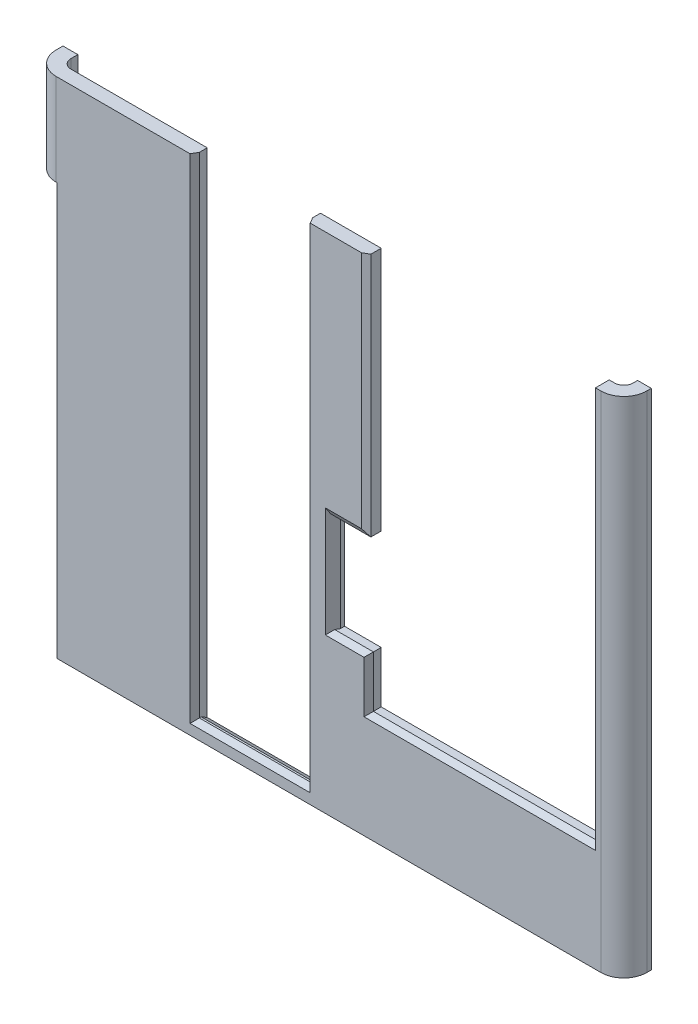
ISO-10303-21;
HEADER;
FILE_DESCRIPTION(('STEP AP214'),'2;1');
FILE_NAME('part.step','',(''),(''),'','','');
FILE_SCHEMA(('AUTOMOTIVE_DESIGN { 1 0 10303 214 1 1 1 1 }'));
ENDSEC;
DATA;
#1=APPLICATION_CONTEXT('core data for automotive mechanical design processes');
#2=APPLICATION_PROTOCOL_DEFINITION('international standard','automotive_design',2000,#1);
#3=PRODUCT_CONTEXT('',#1,'mechanical');
#4=PRODUCT('Part','Part','',(#3));
#5=PRODUCT_RELATED_PRODUCT_CATEGORY('part','',(#4));
#6=PRODUCT_DEFINITION_FORMATION('','',#4);
#7=PRODUCT_DEFINITION_CONTEXT('part definition',#1,'design');
#8=PRODUCT_DEFINITION('design','',#6,#7);
#9=PRODUCT_DEFINITION_SHAPE('','',#8);
#10=(LENGTH_UNIT() NAMED_UNIT(*) SI_UNIT(.MILLI.,.METRE.));
#11=(NAMED_UNIT(*) PLANE_ANGLE_UNIT() SI_UNIT($,.RADIAN.));
#12=(NAMED_UNIT(*) SI_UNIT($,.STERADIAN.) SOLID_ANGLE_UNIT());
#13=UNCERTAINTY_MEASURE_WITH_UNIT(LENGTH_MEASURE(1.E-05),#10,'distance_accuracy_value','');
#14=(GEOMETRIC_REPRESENTATION_CONTEXT(3) GLOBAL_UNCERTAINTY_ASSIGNED_CONTEXT((#13)) GLOBAL_UNIT_ASSIGNED_CONTEXT((#10,
#11,#12)) REPRESENTATION_CONTEXT('',''));
#15=CARTESIAN_POINT('',(0.,0.,0.));
#16=DIRECTION('',(0.,0.,1.));
#17=DIRECTION('',(1.,0.,0.));
#18=AXIS2_PLACEMENT_3D('',#15,#16,#17);
#19=CARTESIAN_POINT('',(0.,0.,0.));
#20=DIRECTION('',(0.,0.,1.));
#21=DIRECTION('',(1.,0.,0.));
#22=AXIS2_PLACEMENT_3D('',#19,#20,#21);
#23=PLANE('',#22);
#24=DIRECTION('',(1.,0.,0.));
#25=VECTOR('',#24,1.);
#26=CARTESIAN_POINT('',(-60.5,-55.,0.));
#27=LINE('',#26,#25);
#28=CARTESIAN_POINT('',(-63.25,-55.,0.));
#29=VERTEX_POINT('',#28);
#30=CARTESIAN_POINT('',(55.5,-55.,0.));
#31=VERTEX_POINT('',#30);
#32=EDGE_CURVE('E372',#29,#31,#27,.T.);
#33=ORIENTED_EDGE('',*,*,#32,.F.);
#34=DIRECTION('',(0.,-1.,0.));
#35=VECTOR('',#34,1.);
#36=CARTESIAN_POINT('',(-63.25,55.,0.));
#37=LINE('',#36,#35);
#38=CARTESIAN_POINT('',(-63.25,35.,0.));
#39=VERTEX_POINT('',#38);
#40=EDGE_CURVE('E499',#29,#39,#37,.F.);
#41=ORIENTED_EDGE('',*,*,#40,.T.);
#42=CARTESIAN_POINT('',(-63.25,55.,0.));
#43=VERTEX_POINT('',#42);
#44=EDGE_CURVE('E498',#39,#43,#37,.F.);
#45=ORIENTED_EDGE('',*,*,#44,.T.);
#46=DIRECTION('',(-1.,0.,0.));
#47=VECTOR('',#46,1.);
#48=CARTESIAN_POINT('',(-60.5,55.,0.));
#49=LINE('',#48,#47);
#50=CARTESIAN_POINT('',(-33.5,55.,0.));
#51=VERTEX_POINT('',#50);
#52=EDGE_CURVE('E383',#51,#43,#49,.T.);
#53=ORIENTED_EDGE('',*,*,#52,.F.);
#54=DIRECTION('',(0.,1.,0.));
#55=VECTOR('',#54,1.);
#56=CARTESIAN_POINT('',(-33.5,55.,0.));
#57=LINE('',#56,#55);
#58=CARTESIAN_POINT('',(-33.5,-52.75,0.));
#59=VERTEX_POINT('',#58);
#60=EDGE_CURVE('E322',#59,#51,#57,.T.);
#61=ORIENTED_EDGE('',*,*,#60,.F.);
#62=DIRECTION('',(1.,0.,0.));
#63=VECTOR('',#62,1.);
#64=CARTESIAN_POINT('',(0.,-52.75,0.));
#65=LINE('',#64,#63);
#66=CARTESIAN_POINT('',(-8.74999999999999,-52.75,0.));
#67=VERTEX_POINT('',#66);
#68=EDGE_CURVE('E437',#59,#67,#65,.T.);
#69=ORIENTED_EDGE('',*,*,#68,.T.);
#70=DIRECTION('',(0.,-1.,0.));
#71=VECTOR('',#70,1.);
#72=CARTESIAN_POINT('',(-8.75,55.,0.));
#73=LINE('',#72,#71);
#74=CARTESIAN_POINT('',(-8.75,55.,0.));
#75=VERTEX_POINT('',#74);
#76=EDGE_CURVE('E320',#75,#67,#73,.T.);
#77=ORIENTED_EDGE('',*,*,#76,.F.);
#78=CARTESIAN_POINT('',(4.5,55.,0.));
#79=VERTEX_POINT('',#78);
#80=EDGE_CURVE('E386',#79,#75,#49,.T.);
#81=ORIENTED_EDGE('',*,*,#80,.F.);
#82=DIRECTION('',(0.,1.,0.));
#83=VECTOR('',#82,1.);
#84=CARTESIAN_POINT('',(4.5,55.,0.));
#85=LINE('',#84,#83);
#86=CARTESIAN_POINT('',(4.5,1.5,0.));
#87=VERTEX_POINT('',#86);
#88=EDGE_CURVE('E338',#87,#79,#85,.T.);
#89=ORIENTED_EDGE('',*,*,#88,.F.);
#90=DIRECTION('',(-1.,0.,0.));
#91=VECTOR('',#90,1.);
#92=CARTESIAN_POINT('',(0.,1.5,0.));
#93=LINE('',#92,#91);
#94=CARTESIAN_POINT('',(-3.5,1.5,0.));
#95=VERTEX_POINT('',#94);
#96=EDGE_CURVE('E299',#87,#95,#93,.T.);
#97=ORIENTED_EDGE('',*,*,#96,.T.);
#98=DIRECTION('',(0.,1.,0.));
#99=VECTOR('',#98,1.);
#100=CARTESIAN_POINT('',(-3.5,0.,0.));
#101=LINE('',#100,#99);
#102=CARTESIAN_POINT('',(-3.5,-20.5,0.));
#103=VERTEX_POINT('',#102);
#104=EDGE_CURVE('E302',#103,#95,#101,.T.);
#105=ORIENTED_EDGE('',*,*,#104,.F.);
#106=DIRECTION('',(-1.,0.,0.));
#107=VECTOR('',#106,1.);
#108=CARTESIAN_POINT('',(0.,-20.5,0.));
#109=LINE('',#108,#107);
#110=CARTESIAN_POINT('',(4.50000000000001,-20.5,0.));
#111=VERTEX_POINT('',#110);
#112=EDGE_CURVE('E305',#111,#103,#109,.T.);
#113=ORIENTED_EDGE('',*,*,#112,.F.);
#114=CARTESIAN_POINT('',(4.50000000000001,-31.75,0.));
#115=VERTEX_POINT('',#114);
#116=EDGE_CURVE('E340',#115,#111,#85,.T.);
#117=ORIENTED_EDGE('',*,*,#116,.F.);
#118=DIRECTION('',(-1.,0.,0.));
#119=VECTOR('',#118,1.);
#120=CARTESIAN_POINT('',(4.50000000000001,-31.75,0.));
#121=LINE('',#120,#119);
#122=CARTESIAN_POINT('',(54.3,-31.75,0.));
#123=VERTEX_POINT('',#122);
#124=EDGE_CURVE('E335',#123,#115,#121,.T.);
#125=ORIENTED_EDGE('',*,*,#124,.F.);
#126=DIRECTION('',(0.,-1.,0.));
#127=VECTOR('',#126,1.);
#128=CARTESIAN_POINT('',(54.3,55.,0.));
#129=LINE('',#128,#127);
#130=CARTESIAN_POINT('',(54.3,55.,0.));
#131=VERTEX_POINT('',#130);
#132=EDGE_CURVE('E336',#131,#123,#129,.T.);
#133=ORIENTED_EDGE('',*,*,#132,.F.);
#134=CARTESIAN_POINT('',(55.5,55.,0.));
#135=VERTEX_POINT('',#134);
#136=EDGE_CURVE('E376',#135,#131,#49,.T.);
#137=ORIENTED_EDGE('',*,*,#136,.F.);
#138=DIRECTION('',(0.,1.,0.));
#139=VECTOR('',#138,1.);
#140=CARTESIAN_POINT('',(55.5,-55.,0.));
#141=LINE('',#140,#139);
#142=EDGE_CURVE('E394',#135,#31,#141,.F.);
#143=ORIENTED_EDGE('',*,*,#142,.T.);
#144=EDGE_LOOP('',(#33,#41,#45,#53,#61,#69,#77,#81,#89,#97,#105,#113,#117,#125,#133,#137,#143));
#145=FACE_BOUND('',#144,.T.);
#146=ADVANCED_FACE('F41',(#145),#23,.F.);
#147=CARTESIAN_POINT('',(0.,0.,3.));
#148=DIRECTION('',(0.,0.,1.));
#149=DIRECTION('',(1.,0.,0.));
#150=AXIS2_PLACEMENT_3D('',#147,#148,#149);
#151=PLANE('',#150);
#152=DIRECTION('',(1.,0.,0.));
#153=VECTOR('',#152,1.);
#154=CARTESIAN_POINT('',(-68.5,35.,3.));
#155=LINE('',#154,#153);
#156=CARTESIAN_POINT('',(-63.5,35.,3.));
#157=VERTEX_POINT('',#156);
#158=CARTESIAN_POINT('',(-63.25,35.,3.));
#159=VERTEX_POINT('',#158);
#160=EDGE_CURVE('E55',#157,#159,#155,.T.);
#161=ORIENTED_EDGE('',*,*,#160,.T.);
#162=DIRECTION('',(0.,-1.,0.));
#163=VECTOR('',#162,1.);
#164=CARTESIAN_POINT('',(-63.25,-55.,3.));
#165=LINE('',#164,#163);
#166=CARTESIAN_POINT('',(-63.25,-55.,3.));
#167=VERTEX_POINT('',#166);
#168=EDGE_CURVE('E258',#159,#167,#165,.T.);
#169=ORIENTED_EDGE('',*,*,#168,.T.);
#170=DIRECTION('',(1.,0.,0.));
#171=VECTOR('',#170,1.);
#172=CARTESIAN_POINT('',(-60.5,-55.,3.));
#173=LINE('',#172,#171);
#174=CARTESIAN_POINT('',(55.5,-55.,3.));
#175=VERTEX_POINT('',#174);
#176=EDGE_CURVE('E373',#167,#175,#173,.T.);
#177=ORIENTED_EDGE('',*,*,#176,.T.);
#178=DIRECTION('',(0.,1.,0.));
#179=VECTOR('',#178,1.);
#180=CARTESIAN_POINT('',(55.5,55.,3.));
#181=LINE('',#180,#179);
#182=CARTESIAN_POINT('',(55.5,55.,3.));
#183=VERTEX_POINT('',#182);
#184=EDGE_CURVE('E401',#175,#183,#181,.T.);
#185=ORIENTED_EDGE('',*,*,#184,.T.);
#186=DIRECTION('',(-1.,0.,0.));
#187=VECTOR('',#186,1.);
#188=CARTESIAN_POINT('',(-60.5,55.,3.));
#189=LINE('',#188,#187);
#190=CARTESIAN_POINT('',(54.3,55.,3.));
#191=VERTEX_POINT('',#190);
#192=EDGE_CURVE('E377',#183,#191,#189,.T.);
#193=ORIENTED_EDGE('',*,*,#192,.T.);
#194=DIRECTION('',(0.,1.,0.));
#195=VECTOR('',#194,1.);
#196=CARTESIAN_POINT('',(54.3,55.,3.));
#197=LINE('',#196,#195);
#198=CARTESIAN_POINT('',(54.3,-32.5,3.));
#199=VERTEX_POINT('',#198);
#200=EDGE_CURVE('E343',#199,#191,#197,.T.);
#201=ORIENTED_EDGE('',*,*,#200,.F.);
#202=DIRECTION('',(-1.,0.,0.));
#203=VECTOR('',#202,1.);
#204=CARTESIAN_POINT('',(4.50000000000001,-32.5,3.));
#205=LINE('',#204,#203);
#206=CARTESIAN_POINT('',(3.75,-32.5,3.));
#207=VERTEX_POINT('',#206);
#208=EDGE_CURVE('E452',#199,#207,#205,.T.);
#209=ORIENTED_EDGE('',*,*,#208,.T.);
#210=DIRECTION('',(0.,1.,0.));
#211=VECTOR('',#210,1.);
#212=CARTESIAN_POINT('',(3.74999999999999,-20.5,3.));
#213=LINE('',#212,#211);
#214=CARTESIAN_POINT('',(3.74999999999999,-21.25,3.));
#215=VERTEX_POINT('',#214);
#216=EDGE_CURVE('E450',#207,#215,#213,.T.);
#217=ORIENTED_EDGE('',*,*,#216,.T.);
#218=DIRECTION('',(-1.,0.,0.));
#219=VECTOR('',#218,1.);
#220=CARTESIAN_POINT('',(-3.5,-21.25,3.));
#221=LINE('',#220,#219);
#222=CARTESIAN_POINT('',(-4.69999999999999,-21.25,3.));
#223=VERTEX_POINT('',#222);
#224=EDGE_CURVE('E448',#215,#223,#221,.T.);
#225=ORIENTED_EDGE('',*,*,#224,.T.);
#226=DIRECTION('',(0.,1.,0.));
#227=VECTOR('',#226,1.);
#228=CARTESIAN_POINT('',(-4.69999999999999,2.79903810567664,3.));
#229=LINE('',#228,#227);
#230=CARTESIAN_POINT('',(-4.69999999999999,2.79903810567664,3.));
#231=VERTEX_POINT('',#230);
#232=EDGE_CURVE('E481',#223,#231,#229,.T.);
#233=ORIENTED_EDGE('',*,*,#232,.T.);
#234=DIRECTION('',(1.,0.,0.));
#235=VECTOR('',#234,1.);
#236=CARTESIAN_POINT('',(0.,2.79903810567664,3.));
#237=LINE('',#236,#235);
#238=CARTESIAN_POINT('',(3.20096189432337,2.79903810567664,3.));
#239=VERTEX_POINT('',#238);
#240=EDGE_CURVE('E454',#231,#239,#237,.T.);
#241=ORIENTED_EDGE('',*,*,#240,.T.);
#242=DIRECTION('',(0.,1.,0.));
#243=VECTOR('',#242,1.);
#244=CARTESIAN_POINT('',(3.20096189432336,55.,3.));
#245=LINE('',#244,#243);
#246=CARTESIAN_POINT('',(3.20096189432337,55.,3.));
#247=VERTEX_POINT('',#246);
#248=EDGE_CURVE('E456',#239,#247,#245,.T.);
#249=ORIENTED_EDGE('',*,*,#248,.T.);
#250=CARTESIAN_POINT('',(-7.99999999999999,55.,3.));
#251=VERTEX_POINT('',#250);
#252=EDGE_CURVE('E381',#247,#251,#189,.T.);
#253=ORIENTED_EDGE('',*,*,#252,.T.);
#254=DIRECTION('',(0.,-1.,0.));
#255=VECTOR('',#254,1.);
#256=CARTESIAN_POINT('',(-7.99999999999997,-52.,3.));
#257=LINE('',#256,#255);
#258=CARTESIAN_POINT('',(-7.99999999999997,-52.75,3.));
#259=VERTEX_POINT('',#258);
#260=EDGE_CURVE('E416',#251,#259,#257,.T.);
#261=ORIENTED_EDGE('',*,*,#260,.T.);
#262=DIRECTION('',(-1.,0.,0.));
#263=VECTOR('',#262,1.);
#264=CARTESIAN_POINT('',(-33.5,-52.75,3.));
#265=LINE('',#264,#263);
#266=CARTESIAN_POINT('',(-34.25,-52.75,3.));
#267=VERTEX_POINT('',#266);
#268=EDGE_CURVE('E414',#259,#267,#265,.T.);
#269=ORIENTED_EDGE('',*,*,#268,.T.);
#270=DIRECTION('',(0.,1.,0.));
#271=VECTOR('',#270,1.);
#272=CARTESIAN_POINT('',(-34.25,55.,3.));
#273=LINE('',#272,#271);
#274=CARTESIAN_POINT('',(-34.25,55.,3.));
#275=VERTEX_POINT('',#274);
#276=EDGE_CURVE('E418',#267,#275,#273,.T.);
#277=ORIENTED_EDGE('',*,*,#276,.T.);
#278=CARTESIAN_POINT('',(-63.5,55.,3.));
#279=VERTEX_POINT('',#278);
#280=EDGE_CURVE('E375',#275,#279,#189,.T.);
#281=ORIENTED_EDGE('',*,*,#280,.T.);
#282=DIRECTION('',(0.,1.,0.));
#283=VECTOR('',#282,1.);
#284=CARTESIAN_POINT('',(-63.5,0.,3.));
#285=LINE('',#284,#283);
#286=EDGE_CURVE('E49',#279,#157,#285,.F.);
#287=ORIENTED_EDGE('',*,*,#286,.T.);
#288=EDGE_LOOP('',(#161,#169,#177,#185,#193,#201,#209,#217,#225,#233,#241,#249,#253,#261,#269,
#277,#281,#287));
#289=FACE_BOUND('',#288,.T.);
#290=ADVANCED_FACE('F272',(#289),#151,.T.);
#291=CARTESIAN_POINT('',(4.5,55.,-109.825145117136));
#292=DIRECTION('',(-1.,0.,0.));
#293=DIRECTION('',(0.,-1.,0.));
#294=AXIS2_PLACEMENT_3D('',#291,#292,#293);
#295=PLANE('',#294);
#296=DIRECTION('',(0.,0.,1.));
#297=VECTOR('',#296,1.);
#298=CARTESIAN_POINT('',(4.5,55.,-109.825145117136));
#299=LINE('',#298,#297);
#300=CARTESIAN_POINT('',(4.5,55.,2.25));
#301=VERTEX_POINT('',#300);
#302=EDGE_CURVE('E339',#79,#301,#299,.T.);
#303=ORIENTED_EDGE('',*,*,#302,.T.);
#304=DIRECTION('',(0.,-1.,0.));
#305=VECTOR('',#304,1.);
#306=CARTESIAN_POINT('',(4.5,1.5,2.25));
#307=LINE('',#306,#305);
#308=CARTESIAN_POINT('',(4.5,1.5,2.25));
#309=VERTEX_POINT('',#308);
#310=EDGE_CURVE('E445',#301,#309,#307,.T.);
#311=ORIENTED_EDGE('',*,*,#310,.T.);
#312=DIRECTION('',(0.,0.,1.));
#313=VECTOR('',#312,1.);
#314=CARTESIAN_POINT('',(4.5,1.5,-23.4093998214393));
#315=LINE('',#314,#313);
#316=EDGE_CURVE('E308',#87,#309,#315,.T.);
#317=ORIENTED_EDGE('',*,*,#316,.F.);
#318=ORIENTED_EDGE('',*,*,#88,.T.);
#319=EDGE_LOOP('',(#303,#311,#317,#318));
#320=FACE_BOUND('',#319,.T.);
#321=ADVANCED_FACE('F586',(#320),#295,.F.);
#322=CARTESIAN_POINT('',(-60.5,55.,3.));
#323=DIRECTION('',(0.,-1.,0.));
#324=DIRECTION('',(0.,0.,-1.));
#325=AXIS2_PLACEMENT_3D('',#322,#323,#324);
#326=PLANE('',#325);
#327=DIRECTION('',(0.,0.,-1.));
#328=VECTOR('',#327,1.);
#329=CARTESIAN_POINT('',(-68.5,55.,0.));
#330=LINE('',#329,#328);
#331=CARTESIAN_POINT('',(-68.5,55.,-2.));
#332=VERTEX_POINT('',#331);
#333=CARTESIAN_POINT('',(-68.5,55.,-3.5));
#334=VERTEX_POINT('',#333);
#335=EDGE_CURVE('E295',#332,#334,#330,.T.);
#336=ORIENTED_EDGE('',*,*,#335,.F.);
#337=CARTESIAN_POINT('',(-63.5,55.,-2.));
#338=DIRECTION('',(0.,-1.,0.));
#339=DIRECTION('',(0.,0.,-1.));
#340=AXIS2_PLACEMENT_3D('',#337,#338,#339);
#341=CIRCLE('',#340,5.);
#342=EDGE_CURVE('E63',#332,#279,#341,.F.);
#343=ORIENTED_EDGE('',*,*,#342,.T.);
#344=ORIENTED_EDGE('',*,*,#280,.F.);
#345=DIRECTION('',(0.500000000000006,0.,-0.866025403784435));
#346=VECTOR('',#345,1.);
#347=CARTESIAN_POINT('',(-33.5,55.,1.70096189432334));
#348=LINE('',#347,#346);
#349=CARTESIAN_POINT('',(-33.5,55.,1.70096189432334));
#350=VERTEX_POINT('',#349);
#351=EDGE_CURVE('E420',#275,#350,#348,.T.);
#352=ORIENTED_EDGE('',*,*,#351,.T.);
#353=DIRECTION('',(0.,0.,1.));
#354=VECTOR('',#353,1.);
#355=CARTESIAN_POINT('',(-33.5,55.,-109.825145117136));
#356=LINE('',#355,#354);
#357=EDGE_CURVE('E323',#51,#350,#356,.T.);
#358=ORIENTED_EDGE('',*,*,#357,.F.);
#359=ORIENTED_EDGE('',*,*,#52,.T.);
#360=CARTESIAN_POINT('',(-63.25,55.,-2.));
#361=DIRECTION('',(0.,-1.,0.));
#362=DIRECTION('',(0.,0.,-1.));
#363=AXIS2_PLACEMENT_3D('',#360,#361,#362);
#364=CIRCLE('',#363,2.);
#365=CARTESIAN_POINT('',(-65.25,55.,-2.));
#366=VERTEX_POINT('',#365);
#367=EDGE_CURVE('E502',#43,#366,#364,.T.);
#368=ORIENTED_EDGE('',*,*,#367,.T.);
#369=DIRECTION('',(0.,0.,1.));
#370=VECTOR('',#369,1.);
#371=CARTESIAN_POINT('',(-65.25,55.,-3.5));
#372=LINE('',#371,#370);
#373=CARTESIAN_POINT('',(-65.25,55.,-3.5));
#374=VERTEX_POINT('',#373);
#375=EDGE_CURVE('E292',#374,#366,#372,.T.);
#376=ORIENTED_EDGE('',*,*,#375,.F.);
#377=DIRECTION('',(1.,0.,0.));
#378=VECTOR('',#377,1.);
#379=CARTESIAN_POINT('',(-68.5,55.,-3.5));
#380=LINE('',#379,#378);
#381=EDGE_CURVE('E287',#334,#374,#380,.T.);
#382=ORIENTED_EDGE('',*,*,#381,.F.);
#383=EDGE_LOOP('',(#336,#343,#344,#352,#358,#359,#368,#376,#382));
#384=FACE_BOUND('',#383,.T.);
#385=ADVANCED_FACE('F513',(#384),#326,.F.);
#386=ORIENTED_EDGE('',*,*,#252,.F.);
#387=DIRECTION('',(0.866025403784436,0.,-0.500000000000005));
#388=VECTOR('',#387,1.);
#389=CARTESIAN_POINT('',(4.5,55.,2.25));
#390=LINE('',#389,#388);
#391=EDGE_CURVE('E458',#247,#301,#390,.T.);
#392=ORIENTED_EDGE('',*,*,#391,.T.);
#393=ORIENTED_EDGE('',*,*,#302,.F.);
#394=ORIENTED_EDGE('',*,*,#80,.T.);
#395=DIRECTION('',(0.,0.,1.));
#396=VECTOR('',#395,1.);
#397=CARTESIAN_POINT('',(-8.75,55.,-109.825145117136));
#398=LINE('',#397,#396);
#399=CARTESIAN_POINT('',(-8.75,55.,1.70096189432334));
#400=VERTEX_POINT('',#399);
#401=EDGE_CURVE('E328',#75,#400,#398,.T.);
#402=ORIENTED_EDGE('',*,*,#401,.T.);
#403=DIRECTION('',(0.500000000000006,0.,0.866025403784435));
#404=VECTOR('',#403,1.);
#405=CARTESIAN_POINT('',(-8.75,55.,1.70096189432334));
#406=LINE('',#405,#404);
#407=EDGE_CURVE('E424',#400,#251,#406,.T.);
#408=ORIENTED_EDGE('',*,*,#407,.T.);
#409=EDGE_LOOP('',(#386,#392,#393,#394,#402,#408));
#410=FACE_BOUND('',#409,.T.);
#411=ADVANCED_FACE('F596',(#410),#326,.F.);
#412=CARTESIAN_POINT('',(-60.5,-55.,3.));
#413=DIRECTION('',(0.,1.,0.));
#414=DIRECTION('',(0.,0.,1.));
#415=AXIS2_PLACEMENT_3D('',#412,#413,#414);
#416=PLANE('',#415);
#417=DIRECTION('',(0.,0.,1.));
#418=VECTOR('',#417,1.);
#419=CARTESIAN_POINT('',(57.5,-55.,-3.));
#420=LINE('',#419,#418);
#421=CARTESIAN_POINT('',(57.5,-55.,-3.));
#422=VERTEX_POINT('',#421);
#423=CARTESIAN_POINT('',(57.5,-55.,-2.));
#424=VERTEX_POINT('',#423);
#425=EDGE_CURVE('E369',#422,#424,#420,.T.);
#426=ORIENTED_EDGE('',*,*,#425,.F.);
#427=DIRECTION('',(-1.,0.,0.));
#428=VECTOR('',#427,1.);
#429=CARTESIAN_POINT('',(60.5,-55.,-3.));
#430=LINE('',#429,#428);
#431=CARTESIAN_POINT('',(60.5,-55.,-3.));
#432=VERTEX_POINT('',#431);
#433=EDGE_CURVE('E360',#432,#422,#430,.T.);
#434=ORIENTED_EDGE('',*,*,#433,.F.);
#435=DIRECTION('',(0.,0.,-1.));
#436=VECTOR('',#435,1.);
#437=CARTESIAN_POINT('',(60.5,-55.,3.));
#438=LINE('',#437,#436);
#439=CARTESIAN_POINT('',(60.5,-55.,-2.));
#440=VERTEX_POINT('',#439);
#441=EDGE_CURVE('E389',#440,#432,#438,.T.);
#442=ORIENTED_EDGE('',*,*,#441,.F.);
#443=CARTESIAN_POINT('',(55.5,-55.,-2.));
#444=DIRECTION('',(0.,1.,0.));
#445=DIRECTION('',(0.,0.,1.));
#446=AXIS2_PLACEMENT_3D('',#443,#444,#445);
#447=CIRCLE('',#446,5.);
#448=EDGE_CURVE('E408',#440,#175,#447,.F.);
#449=ORIENTED_EDGE('',*,*,#448,.T.);
#450=ORIENTED_EDGE('',*,*,#176,.F.);
#451=DIRECTION('',(0.,0.,-1.));
#452=VECTOR('',#451,1.);
#453=CARTESIAN_POINT('',(-63.25,-55.,93.1529949585703));
#454=LINE('',#453,#452);
#455=EDGE_CURVE('E263',#167,#29,#454,.T.);
#456=ORIENTED_EDGE('',*,*,#455,.T.);
#457=ORIENTED_EDGE('',*,*,#32,.T.);
#458=CARTESIAN_POINT('',(55.5,-55.,-2.));
#459=DIRECTION('',(0.,1.,0.));
#460=DIRECTION('',(0.,0.,1.));
#461=AXIS2_PLACEMENT_3D('',#458,#459,#460);
#462=CIRCLE('',#461,2.);
#463=EDGE_CURVE('E399',#31,#424,#462,.T.);
#464=ORIENTED_EDGE('',*,*,#463,.T.);
#465=EDGE_LOOP('',(#426,#434,#442,#449,#450,#456,#457,#464));
#466=FACE_BOUND('',#465,.T.);
#467=ADVANCED_FACE('F531',(#466),#416,.F.);
#468=CARTESIAN_POINT('',(60.5,55.,3.));
#469=DIRECTION('',(-1.,0.,0.));
#470=DIRECTION('',(0.,-1.,0.));
#471=AXIS2_PLACEMENT_3D('',#468,#469,#470);
#472=PLANE('',#471);
#473=DIRECTION('',(0.,0.,-1.));
#474=VECTOR('',#473,1.);
#475=CARTESIAN_POINT('',(60.5,55.,3.));
#476=LINE('',#475,#474);
#477=CARTESIAN_POINT('',(60.5,55.,-2.));
#478=VERTEX_POINT('',#477);
#479=CARTESIAN_POINT('',(60.5,55.,-3.));
#480=VERTEX_POINT('',#479);
#481=EDGE_CURVE('E380',#478,#480,#476,.T.);
#482=ORIENTED_EDGE('',*,*,#481,.F.);
#483=DIRECTION('',(0.,1.,0.));
#484=VECTOR('',#483,1.);
#485=CARTESIAN_POINT('',(60.5,-55.,-2.));
#486=LINE('',#485,#484);
#487=EDGE_CURVE('E406',#478,#440,#486,.F.);
#488=ORIENTED_EDGE('',*,*,#487,.T.);
#489=ORIENTED_EDGE('',*,*,#441,.T.);
#490=DIRECTION('',(0.,-1.,0.));
#491=VECTOR('',#490,1.);
#492=CARTESIAN_POINT('',(60.5,55.,-3.));
#493=LINE('',#492,#491);
#494=EDGE_CURVE('E325',#480,#432,#493,.T.);
#495=ORIENTED_EDGE('',*,*,#494,.F.);
#496=EDGE_LOOP('',(#482,#488,#489,#495));
#497=FACE_BOUND('',#496,.T.);
#498=ADVANCED_FACE('F647',(#497),#472,.F.);
#499=ORIENTED_EDGE('',*,*,#481,.T.);
#500=DIRECTION('',(1.,0.,0.));
#501=VECTOR('',#500,1.);
#502=CARTESIAN_POINT('',(60.5,55.,-3.));
#503=LINE('',#502,#501);
#504=CARTESIAN_POINT('',(57.5,55.,-3.));
#505=VERTEX_POINT('',#504);
#506=EDGE_CURVE('E364',#505,#480,#503,.T.);
#507=ORIENTED_EDGE('',*,*,#506,.F.);
#508=DIRECTION('',(0.,0.,1.));
#509=VECTOR('',#508,1.);
#510=CARTESIAN_POINT('',(57.5,55.,-3.));
#511=LINE('',#510,#509);
#512=CARTESIAN_POINT('',(57.5,55.,-2.));
#513=VERTEX_POINT('',#512);
#514=EDGE_CURVE('E366',#505,#513,#511,.T.);
#515=ORIENTED_EDGE('',*,*,#514,.T.);
#516=CARTESIAN_POINT('',(55.5,55.,-2.));
#517=DIRECTION('',(0.,-1.,0.));
#518=DIRECTION('',(0.,0.,-1.));
#519=AXIS2_PLACEMENT_3D('',#516,#517,#518);
#520=CIRCLE('',#519,2.);
#521=EDGE_CURVE('E397',#513,#135,#520,.T.);
#522=ORIENTED_EDGE('',*,*,#521,.T.);
#523=ORIENTED_EDGE('',*,*,#136,.T.);
#524=DIRECTION('',(0.,0.,1.));
#525=VECTOR('',#524,1.);
#526=CARTESIAN_POINT('',(54.3,55.,-109.825145117136));
#527=LINE('',#526,#525);
#528=EDGE_CURVE('E349',#131,#191,#527,.T.);
#529=ORIENTED_EDGE('',*,*,#528,.T.);
#530=ORIENTED_EDGE('',*,*,#192,.F.);
#531=CARTESIAN_POINT('',(55.5,55.,-2.));
#532=DIRECTION('',(0.,-1.,0.));
#533=DIRECTION('',(0.,0.,-1.));
#534=AXIS2_PLACEMENT_3D('',#531,#532,#533);
#535=CIRCLE('',#534,5.);
#536=EDGE_CURVE('E404',#183,#478,#535,.F.);
#537=ORIENTED_EDGE('',*,*,#536,.T.);
#538=EDGE_LOOP('',(#499,#507,#515,#522,#523,#529,#530,#537));
#539=FACE_BOUND('',#538,.T.);
#540=ADVANCED_FACE('F538',(#539),#326,.F.);
#541=CARTESIAN_POINT('',(57.5,55.,-3.));
#542=DIRECTION('',(1.,0.,0.));
#543=DIRECTION('',(0.,1.,0.));
#544=AXIS2_PLACEMENT_3D('',#541,#542,#543);
#545=PLANE('',#544);
#546=ORIENTED_EDGE('',*,*,#425,.T.);
#547=DIRECTION('',(0.,1.,0.));
#548=VECTOR('',#547,1.);
#549=CARTESIAN_POINT('',(57.5,55.,-2.));
#550=LINE('',#549,#548);
#551=EDGE_CURVE('E391',#424,#513,#550,.T.);
#552=ORIENTED_EDGE('',*,*,#551,.T.);
#553=ORIENTED_EDGE('',*,*,#514,.F.);
#554=DIRECTION('',(0.,1.,0.));
#555=VECTOR('',#554,1.);
#556=CARTESIAN_POINT('',(57.5,55.,-3.));
#557=LINE('',#556,#555);
#558=EDGE_CURVE('E362',#422,#505,#557,.T.);
#559=ORIENTED_EDGE('',*,*,#558,.F.);
#560=EDGE_LOOP('',(#546,#552,#553,#559));
#561=FACE_BOUND('',#560,.T.);
#562=ADVANCED_FACE('F646',(#561),#545,.F.);
#563=CARTESIAN_POINT('',(0.,0.,-3.));
#564=DIRECTION('',(0.,0.,-1.));
#565=DIRECTION('',(-1.,0.,0.));
#566=AXIS2_PLACEMENT_3D('',#563,#564,#565);
#567=PLANE('',#566);
#568=ORIENTED_EDGE('',*,*,#506,.T.);
#569=ORIENTED_EDGE('',*,*,#494,.T.);
#570=ORIENTED_EDGE('',*,*,#433,.T.);
#571=ORIENTED_EDGE('',*,*,#558,.T.);
#572=EDGE_LOOP('',(#568,#569,#570,#571));
#573=FACE_BOUND('',#572,.T.);
#574=ADVANCED_FACE('F657',(#573),#567,.T.);
#575=CARTESIAN_POINT('',(55.5,55.,-2.));
#576=DIRECTION('',(0.,-1.,0.));
#577=DIRECTION('',(1.,0.,0.));
#578=AXIS2_PLACEMENT_3D('',#575,#576,#577);
#579=CYLINDRICAL_SURFACE('',#578,2.);
#580=ORIENTED_EDGE('',*,*,#463,.F.);
#581=ORIENTED_EDGE('',*,*,#142,.F.);
#582=ORIENTED_EDGE('',*,*,#521,.F.);
#583=ORIENTED_EDGE('',*,*,#551,.F.);
#584=EDGE_LOOP('',(#580,#581,#582,#583));
#585=FACE_BOUND('',#584,.T.);
#586=ADVANCED_FACE('F653',(#585),#579,.F.);
#587=CARTESIAN_POINT('',(55.5,0.,-2.));
#588=DIRECTION('',(0.,-1.,0.));
#589=DIRECTION('',(1.,0.,0.));
#590=AXIS2_PLACEMENT_3D('',#587,#588,#589);
#591=CYLINDRICAL_SURFACE('',#590,5.);
#592=ORIENTED_EDGE('',*,*,#448,.F.);
#593=ORIENTED_EDGE('',*,*,#487,.F.);
#594=ORIENTED_EDGE('',*,*,#536,.F.);
#595=ORIENTED_EDGE('',*,*,#184,.F.);
#596=EDGE_LOOP('',(#592,#593,#594,#595));
#597=FACE_BOUND('',#596,.T.);
#598=ADVANCED_FACE('F656',(#597),#591,.T.);
#599=DIRECTION('',(0.,0.,1.));
#600=VECTOR('',#599,1.);
#601=CARTESIAN_POINT('',(4.50000000000001,-20.5,-23.4093998214393));
#602=LINE('',#601,#600);
#603=CARTESIAN_POINT('',(4.50000000000001,-20.5,1.70096189432333));
#604=VERTEX_POINT('',#603);
#605=EDGE_CURVE('E311',#111,#604,#602,.T.);
#606=ORIENTED_EDGE('',*,*,#605,.T.);
#607=DIRECTION('',(0.,-1.,0.));
#608=VECTOR('',#607,1.);
#609=CARTESIAN_POINT('',(4.50000000000001,-31.75,1.70096189432334));
#610=LINE('',#609,#608);
#611=CARTESIAN_POINT('',(4.50000000000001,-31.75,1.70096189432334));
#612=VERTEX_POINT('',#611);
#613=EDGE_CURVE('E465',#604,#612,#610,.T.);
#614=ORIENTED_EDGE('',*,*,#613,.T.);
#615=DIRECTION('',(0.,0.,1.));
#616=VECTOR('',#615,1.);
#617=CARTESIAN_POINT('',(4.50000000000001,-31.75,-109.825145117136));
#618=LINE('',#617,#616);
#619=EDGE_CURVE('E345',#115,#612,#618,.T.);
#620=ORIENTED_EDGE('',*,*,#619,.F.);
#621=ORIENTED_EDGE('',*,*,#116,.T.);
#622=EDGE_LOOP('',(#606,#614,#620,#621));
#623=FACE_BOUND('',#622,.T.);
#624=ADVANCED_FACE('F554',(#623),#295,.F.);
#625=CARTESIAN_POINT('',(54.3,55.,-109.825145117136));
#626=DIRECTION('',(1.,0.,0.));
#627=DIRECTION('',(0.,1.,0.));
#628=AXIS2_PLACEMENT_3D('',#625,#626,#627);
#629=PLANE('',#628);
#630=ORIENTED_EDGE('',*,*,#132,.T.);
#631=DIRECTION('',(0.,0.,1.));
#632=VECTOR('',#631,1.);
#633=CARTESIAN_POINT('',(54.3,-31.75,-109.825145117136));
#634=LINE('',#633,#632);
#635=CARTESIAN_POINT('',(54.3,-31.75,1.70096189432334));
#636=VERTEX_POINT('',#635);
#637=EDGE_CURVE('E352',#123,#636,#634,.T.);
#638=ORIENTED_EDGE('',*,*,#637,.T.);
#639=DIRECTION('',(0.,-0.500000000000006,0.866025403784435));
#640=VECTOR('',#639,1.);
#641=CARTESIAN_POINT('',(54.3,38.2297209285538,-119.507470253421));
#642=LINE('',#641,#640);
#643=EDGE_CURVE('E469',#636,#199,#642,.T.);
#644=ORIENTED_EDGE('',*,*,#643,.T.);
#645=ORIENTED_EDGE('',*,*,#200,.T.);
#646=ORIENTED_EDGE('',*,*,#528,.F.);
#647=EDGE_LOOP('',(#630,#638,#644,#645,#646));
#648=FACE_BOUND('',#647,.T.);
#649=ADVANCED_FACE('F543',(#648),#629,.F.);
#650=CARTESIAN_POINT('',(4.50000000000001,-31.75,-109.825145117136));
#651=DIRECTION('',(0.,-1.,0.));
#652=DIRECTION('',(0.,0.,-1.));
#653=AXIS2_PLACEMENT_3D('',#650,#651,#652);
#654=PLANE('',#653);
#655=ORIENTED_EDGE('',*,*,#619,.T.);
#656=DIRECTION('',(1.,0.,0.));
#657=VECTOR('',#656,1.);
#658=CARTESIAN_POINT('',(54.3,-31.75,1.70096189432334));
#659=LINE('',#658,#657);
#660=EDGE_CURVE('E462',#612,#636,#659,.T.);
#661=ORIENTED_EDGE('',*,*,#660,.T.);
#662=ORIENTED_EDGE('',*,*,#637,.F.);
#663=ORIENTED_EDGE('',*,*,#124,.T.);
#664=EDGE_LOOP('',(#655,#661,#662,#663));
#665=FACE_BOUND('',#664,.T.);
#666=ADVANCED_FACE('F551',(#665),#654,.F.);
#667=CARTESIAN_POINT('',(-33.5,55.,-109.825145117136));
#668=DIRECTION('',(-1.,0.,0.));
#669=DIRECTION('',(0.,-1.,0.));
#670=AXIS2_PLACEMENT_3D('',#667,#668,#669);
#671=PLANE('',#670);
#672=ORIENTED_EDGE('',*,*,#357,.T.);
#673=DIRECTION('',(0.,-1.,0.));
#674=VECTOR('',#673,1.);
#675=CARTESIAN_POINT('',(-33.5,-52.,1.70096189432334));
#676=LINE('',#675,#674);
#677=CARTESIAN_POINT('',(-33.5,-52.,1.70096189432334));
#678=VERTEX_POINT('',#677);
#679=EDGE_CURVE('E411',#350,#678,#676,.T.);
#680=ORIENTED_EDGE('',*,*,#679,.T.);
#681=DIRECTION('',(0.,0.,1.));
#682=VECTOR('',#681,1.);
#683=CARTESIAN_POINT('',(-33.5,-52.,-109.825145117136));
#684=LINE('',#683,#682);
#685=CARTESIAN_POINT('',(-33.5,-52.,1.29903810567666));
#686=VERTEX_POINT('',#685);
#687=EDGE_CURVE('E333',#686,#678,#684,.T.);
#688=ORIENTED_EDGE('',*,*,#687,.F.);
#689=DIRECTION('',(0.,0.500000000000006,0.866025403784436));
#690=VECTOR('',#689,1.);
#691=CARTESIAN_POINT('',(-33.5,-73.368182822876,-35.7117402089645));
#692=LINE('',#691,#690);
#693=EDGE_CURVE('E440',#686,#59,#692,.F.);
#694=ORIENTED_EDGE('',*,*,#693,.T.);
#695=ORIENTED_EDGE('',*,*,#60,.T.);
#696=EDGE_LOOP('',(#672,#680,#688,#694,#695));
#697=FACE_BOUND('',#696,.T.);
#698=ADVANCED_FACE('F609',(#697),#671,.F.);
#699=CARTESIAN_POINT('',(-8.75,55.,-109.825145117136));
#700=DIRECTION('',(1.,0.,0.));
#701=DIRECTION('',(0.,1.,0.));
#702=AXIS2_PLACEMENT_3D('',#699,#700,#701);
#703=PLANE('',#702);
#704=ORIENTED_EDGE('',*,*,#76,.T.);
#705=DIRECTION('',(0.,-0.500000000000006,-0.866025403784436));
#706=VECTOR('',#705,1.);
#707=CARTESIAN_POINT('',(-8.74999999999998,-73.368182822876,-35.7117402089645));
#708=LINE('',#707,#706);
#709=CARTESIAN_POINT('',(-8.74999999999999,-52.,1.29903810567666));
#710=VERTEX_POINT('',#709);
#711=EDGE_CURVE('E443',#67,#710,#708,.F.);
#712=ORIENTED_EDGE('',*,*,#711,.T.);
#713=DIRECTION('',(0.,0.,1.));
#714=VECTOR('',#713,1.);
#715=CARTESIAN_POINT('',(-8.74999999999999,-52.,-109.825145117136));
#716=LINE('',#715,#714);
#717=CARTESIAN_POINT('',(-8.74999999999999,-52.,1.70096189432334));
#718=VERTEX_POINT('',#717);
#719=EDGE_CURVE('E331',#710,#718,#716,.T.);
#720=ORIENTED_EDGE('',*,*,#719,.T.);
#721=DIRECTION('',(0.,1.,0.));
#722=VECTOR('',#721,1.);
#723=CARTESIAN_POINT('',(-8.75,55.,1.70096189432334));
#724=LINE('',#723,#722);
#725=EDGE_CURVE('E422',#718,#400,#724,.T.);
#726=ORIENTED_EDGE('',*,*,#725,.T.);
#727=ORIENTED_EDGE('',*,*,#401,.F.);
#728=EDGE_LOOP('',(#704,#712,#720,#726,#727));
#729=FACE_BOUND('',#728,.T.);
#730=ADVANCED_FACE('F617',(#729),#703,.F.);
#731=CARTESIAN_POINT('',(-33.5,-52.,-109.825145117136));
#732=DIRECTION('',(0.,-1.,0.));
#733=DIRECTION('',(0.,0.,-1.));
#734=AXIS2_PLACEMENT_3D('',#731,#732,#733);
#735=PLANE('',#734);
#736=ORIENTED_EDGE('',*,*,#719,.F.);
#737=DIRECTION('',(-1.,0.,0.));
#738=VECTOR('',#737,1.);
#739=CARTESIAN_POINT('',(-33.5,-52.,1.29903810567666));
#740=LINE('',#739,#738);
#741=EDGE_CURVE('E430',#710,#686,#740,.T.);
#742=ORIENTED_EDGE('',*,*,#741,.T.);
#743=ORIENTED_EDGE('',*,*,#687,.T.);
#744=DIRECTION('',(1.,0.,0.));
#745=VECTOR('',#744,1.);
#746=CARTESIAN_POINT('',(-8.74999999999999,-52.,1.70096189432334));
#747=LINE('',#746,#745);
#748=EDGE_CURVE('E427',#678,#718,#747,.T.);
#749=ORIENTED_EDGE('',*,*,#748,.T.);
#750=EDGE_LOOP('',(#736,#742,#743,#749));
#751=FACE_BOUND('',#750,.T.);
#752=ADVANCED_FACE('F619',(#751),#735,.F.);
#753=CARTESIAN_POINT('',(-8.75,55.,1.70096189432334));
#754=DIRECTION('',(-0.866025403784435,0.,0.500000000000006));
#755=DIRECTION('',(0.,-1.,0.));
#756=AXIS2_PLACEMENT_3D('',#753,#754,#755);
#757=PLANE('',#756);
#758=ORIENTED_EDGE('',*,*,#407,.F.);
#759=ORIENTED_EDGE('',*,*,#725,.F.);
#760=DIRECTION('',(-0.447213595499962,0.447213595499962,-0.774596669241478));
#761=VECTOR('',#760,1.);
#762=CARTESIAN_POINT('',(-30.1500000000004,-30.5999999999996,-35.3649253876508));
#763=LINE('',#762,#761);
#764=EDGE_CURVE('E346',#259,#718,#763,.T.);
#765=ORIENTED_EDGE('',*,*,#764,.F.);
#766=ORIENTED_EDGE('',*,*,#260,.F.);
#767=EDGE_LOOP('',(#758,#759,#765,#766));
#768=FACE_BOUND('',#767,.T.);
#769=ADVANCED_FACE('F624',(#768),#757,.T.);
#770=CARTESIAN_POINT('',(-33.5,-52.,1.70096189432334));
#771=DIRECTION('',(0.,0.866025403784435,0.500000000000006));
#772=DIRECTION('',(-1.,0.,0.));
#773=AXIS2_PLACEMENT_3D('',#770,#771,#772);
#774=PLANE('',#773);
#775=ORIENTED_EDGE('',*,*,#764,.T.);
#776=ORIENTED_EDGE('',*,*,#748,.F.);
#777=DIRECTION('',(-0.447213595499962,-0.447213595499962,0.774596669241478));
#778=VECTOR('',#777,1.);
#779=CARTESIAN_POINT('',(-12.0999999999996,-30.5999999999996,-35.3649253876507));
#780=LINE('',#779,#778);
#781=EDGE_CURVE('E319',#267,#678,#780,.F.);
#782=ORIENTED_EDGE('',*,*,#781,.F.);
#783=ORIENTED_EDGE('',*,*,#268,.F.);
#784=EDGE_LOOP('',(#775,#776,#782,#783));
#785=FACE_BOUND('',#784,.T.);
#786=ADVANCED_FACE('F626',(#785),#774,.T.);
#787=CARTESIAN_POINT('',(-33.5,55.,1.70096189432334));
#788=DIRECTION('',(0.866025403784435,0.,0.500000000000006));
#789=DIRECTION('',(0.,1.,0.));
#790=AXIS2_PLACEMENT_3D('',#787,#788,#789);
#791=PLANE('',#790);
#792=ORIENTED_EDGE('',*,*,#351,.F.);
#793=ORIENTED_EDGE('',*,*,#276,.F.);
#794=ORIENTED_EDGE('',*,*,#781,.T.);
#795=ORIENTED_EDGE('',*,*,#679,.F.);
#796=EDGE_LOOP('',(#792,#793,#794,#795));
#797=FACE_BOUND('',#796,.T.);
#798=ADVANCED_FACE('F604',(#797),#791,.T.);
#799=CARTESIAN_POINT('',(-33.5,-52.,1.29903810567666));
#800=DIRECTION('',(0.,-0.866025403784435,0.500000000000005));
#801=DIRECTION('',(-1.,0.,0.));
#802=AXIS2_PLACEMENT_3D('',#799,#800,#801);
#803=PLANE('',#802);
#804=ORIENTED_EDGE('',*,*,#711,.F.);
#805=ORIENTED_EDGE('',*,*,#68,.F.);
#806=ORIENTED_EDGE('',*,*,#693,.F.);
#807=ORIENTED_EDGE('',*,*,#741,.F.);
#808=EDGE_LOOP('',(#804,#805,#806,#807));
#809=FACE_BOUND('',#808,.T.);
#810=ADVANCED_FACE('F614',(#809),#803,.F.);
#811=CARTESIAN_POINT('',(-3.5,0.,-23.4093998214393));
#812=DIRECTION('',(-1.,0.,0.));
#813=DIRECTION('',(0.,0.,1.));
#814=AXIS2_PLACEMENT_3D('',#811,#812,#813);
#815=PLANE('',#814);
#816=DIRECTION('',(0.,0.,1.));
#817=VECTOR('',#816,1.);
#818=CARTESIAN_POINT('',(-3.5,1.5,-23.4093998214393));
#819=LINE('',#818,#817);
#820=CARTESIAN_POINT('',(-3.5,1.5,0.921539030917375));
#821=VERTEX_POINT('',#820);
#822=EDGE_CURVE('E303',#95,#821,#819,.T.);
#823=ORIENTED_EDGE('',*,*,#822,.T.);
#824=DIRECTION('',(0.,-1.,0.));
#825=VECTOR('',#824,1.);
#826=CARTESIAN_POINT('',(-3.5,-21.25,0.921539030917375));
#827=LINE('',#826,#825);
#828=CARTESIAN_POINT('',(-3.5,-20.5,0.921539030917375));
#829=VERTEX_POINT('',#828);
#830=EDGE_CURVE('E472',#821,#829,#827,.T.);
#831=ORIENTED_EDGE('',*,*,#830,.T.);
#832=DIRECTION('',(0.,0.,1.));
#833=VECTOR('',#832,1.);
#834=CARTESIAN_POINT('',(-3.5,-20.5,-23.4093998214393));
#835=LINE('',#834,#833);
#836=EDGE_CURVE('E314',#103,#829,#835,.T.);
#837=ORIENTED_EDGE('',*,*,#836,.F.);
#838=ORIENTED_EDGE('',*,*,#104,.T.);
#839=EDGE_LOOP('',(#823,#831,#837,#838));
#840=FACE_BOUND('',#839,.T.);
#841=ADVANCED_FACE('F713',(#840),#815,.F.);
#842=CARTESIAN_POINT('',(0.,1.5,-23.4093998214393));
#843=DIRECTION('',(0.,-1.,0.));
#844=DIRECTION('',(0.,0.,-1.));
#845=AXIS2_PLACEMENT_3D('',#842,#843,#844);
#846=PLANE('',#845);
#847=ORIENTED_EDGE('',*,*,#316,.T.);
#848=DIRECTION('',(-1.,0.,0.));
#849=VECTOR('',#848,1.);
#850=CARTESIAN_POINT('',(0.,1.5,2.25));
#851=LINE('',#850,#849);
#852=CARTESIAN_POINT('',(-4.26698729810777,1.5,2.25));
#853=VERTEX_POINT('',#852);
#854=EDGE_CURVE('E460',#309,#853,#851,.T.);
#855=ORIENTED_EDGE('',*,*,#854,.T.);
#856=DIRECTION('',(0.500000000000003,0.,-0.866025403784437));
#857=VECTOR('',#856,1.);
#858=CARTESIAN_POINT('',(-3.5,1.5,0.921539030917375));
#859=LINE('',#858,#857);
#860=EDGE_CURVE('E493',#853,#821,#859,.T.);
#861=ORIENTED_EDGE('',*,*,#860,.T.);
#862=ORIENTED_EDGE('',*,*,#822,.F.);
#863=ORIENTED_EDGE('',*,*,#96,.F.);
#864=EDGE_LOOP('',(#847,#855,#861,#862,#863));
#865=FACE_BOUND('',#864,.T.);
#866=ADVANCED_FACE('F589',(#865),#846,.T.);
#867=CARTESIAN_POINT('',(0.,-20.5,-23.4093998214393));
#868=DIRECTION('',(0.,-1.,0.));
#869=DIRECTION('',(0.,0.,-1.));
#870=AXIS2_PLACEMENT_3D('',#867,#868,#869);
#871=PLANE('',#870);
#872=ORIENTED_EDGE('',*,*,#836,.T.);
#873=DIRECTION('',(-0.500000000000003,0.,0.866025403784437));
#874=VECTOR('',#873,1.);
#875=CARTESIAN_POINT('',(7.91060557203336,-20.5,-18.8422095649728));
#876=LINE('',#875,#874);
#877=CARTESIAN_POINT('',(-3.94999999999998,-20.5,1.70096189432333));
#878=VERTEX_POINT('',#877);
#879=EDGE_CURVE('E484',#829,#878,#876,.T.);
#880=ORIENTED_EDGE('',*,*,#879,.T.);
#881=DIRECTION('',(1.,0.,0.));
#882=VECTOR('',#881,1.);
#883=CARTESIAN_POINT('',(4.50000000000001,-20.5,1.70096189432333));
#884=LINE('',#883,#882);
#885=EDGE_CURVE('E467',#878,#604,#884,.T.);
#886=ORIENTED_EDGE('',*,*,#885,.T.);
#887=ORIENTED_EDGE('',*,*,#605,.F.);
#888=ORIENTED_EDGE('',*,*,#112,.T.);
#889=EDGE_LOOP('',(#872,#880,#886,#887,#888));
#890=FACE_BOUND('',#889,.T.);
#891=ADVANCED_FACE('F712',(#890),#871,.F.);
#892=CARTESIAN_POINT('',(0.,2.79903810567664,3.));
#893=DIRECTION('',(0.,0.500000000000007,-0.866025403784435));
#894=DIRECTION('',(1.,0.,0.));
#895=AXIS2_PLACEMENT_3D('',#892,#893,#894);
#896=PLANE('',#895);
#897=ORIENTED_EDGE('',*,*,#240,.F.);
#898=DIRECTION('',(-0.27735009811262,0.832050294337838,0.480384461415267));
#899=VECTOR('',#898,1.);
#900=CARTESIAN_POINT('',(-3.68483736022844,-0.246449813637929,1.24168672996995));
#901=LINE('',#900,#899);
#902=EDGE_CURVE('E490',#231,#853,#901,.F.);
#903=ORIENTED_EDGE('',*,*,#902,.T.);
#904=ORIENTED_EDGE('',*,*,#854,.F.);
#905=DIRECTION('',(0.654653670707977,-0.654653670707974,-0.377964473009232));
#906=VECTOR('',#905,1.);
#907=CARTESIAN_POINT('',(1.8291210824705,4.1708789175295,3.79203266200858));
#908=LINE('',#907,#906);
#909=EDGE_CURVE('E317',#239,#309,#908,.T.);
#910=ORIENTED_EDGE('',*,*,#909,.F.);
#911=EDGE_LOOP('',(#897,#903,#904,#910));
#912=FACE_BOUND('',#911,.T.);
#913=ADVANCED_FACE('F582',(#912),#896,.F.);
#914=CARTESIAN_POINT('',(4.5,55.,2.25));
#915=DIRECTION('',(0.500000000000005,0.,0.866025403784436));
#916=DIRECTION('',(0.,1.,0.));
#917=AXIS2_PLACEMENT_3D('',#914,#915,#916);
#918=PLANE('',#917);
#919=ORIENTED_EDGE('',*,*,#391,.F.);
#920=ORIENTED_EDGE('',*,*,#248,.F.);
#921=ORIENTED_EDGE('',*,*,#909,.T.);
#922=ORIENTED_EDGE('',*,*,#310,.F.);
#923=EDGE_LOOP('',(#919,#920,#921,#922));
#924=FACE_BOUND('',#923,.T.);
#925=ADVANCED_FACE('F579',(#924),#918,.T.);
#926=CARTESIAN_POINT('',(0.,-20.5,1.70096189432333));
#927=DIRECTION('',(0.,0.866025403784436,0.500000000000005));
#928=DIRECTION('',(-1.,0.,0.));
#929=AXIS2_PLACEMENT_3D('',#926,#927,#928);
#930=PLANE('',#929);
#931=ORIENTED_EDGE('',*,*,#885,.F.);
#932=DIRECTION('',(-0.447213595499959,-0.447213595499962,0.77459666924148));
#933=VECTOR('',#932,1.);
#934=CARTESIAN_POINT('',(0.510000000000053,-16.0399999999999,-6.02398470743386));
#935=LINE('',#934,#933);
#936=EDGE_CURVE('E487',#878,#223,#935,.T.);
#937=ORIENTED_EDGE('',*,*,#936,.T.);
#938=ORIENTED_EDGE('',*,*,#224,.F.);
#939=DIRECTION('',(0.447213595499963,0.447213595499961,-0.774596669241479));
#940=VECTOR('',#939,1.);
#941=CARTESIAN_POINT('',(3.59999999999999,-21.4,3.25980762113533));
#942=LINE('',#941,#940);
#943=EDGE_CURVE('E474',#604,#215,#942,.F.);
#944=ORIENTED_EDGE('',*,*,#943,.F.);
#945=EDGE_LOOP('',(#931,#937,#938,#944));
#946=FACE_BOUND('',#945,.T.);
#947=ADVANCED_FACE('F566',(#946),#930,.T.);
#948=CARTESIAN_POINT('',(4.5,55.,1.70096189432334));
#949=DIRECTION('',(0.866025403784435,0.,0.500000000000006));
#950=DIRECTION('',(0.,1.,0.));
#951=AXIS2_PLACEMENT_3D('',#948,#949,#950);
#952=PLANE('',#951);
#953=ORIENTED_EDGE('',*,*,#943,.T.);
#954=ORIENTED_EDGE('',*,*,#216,.F.);
#955=DIRECTION('',(0.447213595499962,0.447213595499962,-0.774596669241478));
#956=VECTOR('',#955,1.);
#957=CARTESIAN_POINT('',(4.50000000000001,-31.75,1.70096189432334));
#958=LINE('',#957,#956);
#959=EDGE_CURVE('E298',#612,#207,#958,.F.);
#960=ORIENTED_EDGE('',*,*,#959,.F.);
#961=ORIENTED_EDGE('',*,*,#613,.F.);
#962=EDGE_LOOP('',(#953,#954,#960,#961));
#963=FACE_BOUND('',#962,.T.);
#964=ADVANCED_FACE('F558',(#963),#952,.T.);
#965=CARTESIAN_POINT('',(4.50000000000001,-31.75,1.70096189432334));
#966=DIRECTION('',(0.,0.866025403784435,0.500000000000006));
#967=DIRECTION('',(-1.,0.,0.));
#968=AXIS2_PLACEMENT_3D('',#965,#966,#967);
#969=PLANE('',#968);
#970=ORIENTED_EDGE('',*,*,#959,.T.);
#971=ORIENTED_EDGE('',*,*,#208,.F.);
#972=ORIENTED_EDGE('',*,*,#643,.F.);
#973=ORIENTED_EDGE('',*,*,#660,.F.);
#974=EDGE_LOOP('',(#970,#971,#972,#973));
#975=FACE_BOUND('',#974,.T.);
#976=ADVANCED_FACE('F563',(#975),#969,.T.);
#977=CARTESIAN_POINT('',(-3.5,0.,0.921539030917375));
#978=DIRECTION('',(0.866025403784437,0.,0.500000000000003));
#979=DIRECTION('',(0.,1.,0.));
#980=AXIS2_PLACEMENT_3D('',#977,#978,#979);
#981=PLANE('',#980);
#982=ORIENTED_EDGE('',*,*,#902,.F.);
#983=ORIENTED_EDGE('',*,*,#232,.F.);
#984=ORIENTED_EDGE('',*,*,#936,.F.);
#985=ORIENTED_EDGE('',*,*,#879,.F.);
#986=ORIENTED_EDGE('',*,*,#830,.F.);
#987=ORIENTED_EDGE('',*,*,#860,.F.);
#988=EDGE_LOOP('',(#982,#983,#984,#985,#986,#987));
#989=FACE_BOUND('',#988,.T.);
#990=ADVANCED_FACE('F571',(#989),#981,.T.);
#991=CARTESIAN_POINT('',(-68.5,0.,0.));
#992=DIRECTION('',(-1.,0.,0.));
#993=DIRECTION('',(0.,-1.,0.));
#994=AXIS2_PLACEMENT_3D('',#991,#992,#993);
#995=PLANE('',#994);
#996=DIRECTION('',(0.,0.,-1.));
#997=VECTOR('',#996,1.);
#998=CARTESIAN_POINT('',(-68.5,35.,93.1529949585703));
#999=LINE('',#998,#997);
#1000=CARTESIAN_POINT('',(-68.5,35.,-2.));
#1001=VERTEX_POINT('',#1000);
#1002=CARTESIAN_POINT('',(-68.5,35.,-3.5));
#1003=VERTEX_POINT('',#1002);
#1004=EDGE_CURVE('E278',#1001,#1003,#999,.T.);
#1005=ORIENTED_EDGE('',*,*,#1004,.F.);
#1006=DIRECTION('',(0.,1.,0.));
#1007=VECTOR('',#1006,1.);
#1008=CARTESIAN_POINT('',(-68.5,0.,-2.));
#1009=LINE('',#1008,#1007);
#1010=EDGE_CURVE('E504',#1001,#332,#1009,.T.);
#1011=ORIENTED_EDGE('',*,*,#1010,.T.);
#1012=ORIENTED_EDGE('',*,*,#335,.T.);
#1013=DIRECTION('',(0.,1.,0.));
#1014=VECTOR('',#1013,1.);
#1015=CARTESIAN_POINT('',(-68.5,-55.,-3.5));
#1016=LINE('',#1015,#1014);
#1017=EDGE_CURVE('E285',#1003,#334,#1016,.T.);
#1018=ORIENTED_EDGE('',*,*,#1017,.F.);
#1019=EDGE_LOOP('',(#1005,#1011,#1012,#1018));
#1020=FACE_BOUND('',#1019,.T.);
#1021=ADVANCED_FACE('F509',(#1020),#995,.T.);
#1022=CARTESIAN_POINT('',(-65.25,-55.,-3.5));
#1023=DIRECTION('',(-1.,0.,0.));
#1024=DIRECTION('',(0.,0.,1.));
#1025=AXIS2_PLACEMENT_3D('',#1022,#1023,#1024);
#1026=PLANE('',#1025);
#1027=DIRECTION('',(0.,-1.,0.));
#1028=VECTOR('',#1027,1.);
#1029=CARTESIAN_POINT('',(-65.25,-55.,-2.));
#1030=LINE('',#1029,#1028);
#1031=CARTESIAN_POINT('',(-65.25,35.,-2.));
#1032=VERTEX_POINT('',#1031);
#1033=EDGE_CURVE('E495',#366,#1032,#1030,.T.);
#1034=ORIENTED_EDGE('',*,*,#1033,.T.);
#1035=DIRECTION('',(0.,0.,-1.));
#1036=VECTOR('',#1035,1.);
#1037=CARTESIAN_POINT('',(-65.25,35.,-3.5));
#1038=LINE('',#1037,#1036);
#1039=CARTESIAN_POINT('',(-65.25,35.,-3.5));
#1040=VERTEX_POINT('',#1039);
#1041=EDGE_CURVE('E282',#1032,#1040,#1038,.T.);
#1042=ORIENTED_EDGE('',*,*,#1041,.T.);
#1043=DIRECTION('',(0.,-1.,0.));
#1044=VECTOR('',#1043,1.);
#1045=CARTESIAN_POINT('',(-65.25,-55.,-3.5));
#1046=LINE('',#1045,#1044);
#1047=EDGE_CURVE('E289',#374,#1040,#1046,.T.);
#1048=ORIENTED_EDGE('',*,*,#1047,.F.);
#1049=ORIENTED_EDGE('',*,*,#375,.T.);
#1050=EDGE_LOOP('',(#1034,#1042,#1048,#1049));
#1051=FACE_BOUND('',#1050,.T.);
#1052=ADVANCED_FACE('F520',(#1051),#1026,.F.);
#1053=CARTESIAN_POINT('',(0.,0.,-3.5));
#1054=DIRECTION('',(0.,0.,-1.));
#1055=DIRECTION('',(-1.,0.,0.));
#1056=AXIS2_PLACEMENT_3D('',#1053,#1054,#1055);
#1057=PLANE('',#1056);
#1058=DIRECTION('',(1.,0.,0.));
#1059=VECTOR('',#1058,1.);
#1060=CARTESIAN_POINT('',(-68.5,35.,-3.5));
#1061=LINE('',#1060,#1059);
#1062=EDGE_CURVE('E274',#1003,#1040,#1061,.T.);
#1063=ORIENTED_EDGE('',*,*,#1062,.F.);
#1064=ORIENTED_EDGE('',*,*,#1017,.T.);
#1065=ORIENTED_EDGE('',*,*,#381,.T.);
#1066=ORIENTED_EDGE('',*,*,#1047,.T.);
#1067=EDGE_LOOP('',(#1063,#1064,#1065,#1066));
#1068=FACE_BOUND('',#1067,.T.);
#1069=ADVANCED_FACE('F518',(#1068),#1057,.T.);
#1070=CARTESIAN_POINT('',(-63.25,-55.,-2.));
#1071=DIRECTION('',(0.,1.,0.));
#1072=DIRECTION('',(0.,0.,1.));
#1073=AXIS2_PLACEMENT_3D('',#1070,#1071,#1072);
#1074=CYLINDRICAL_SURFACE('',#1073,2.);
#1075=ORIENTED_EDGE('',*,*,#44,.F.);
#1076=CARTESIAN_POINT('',(-63.25,35.,-2.));
#1077=DIRECTION('',(0.,1.,0.));
#1078=DIRECTION('',(0.,0.,1.));
#1079=AXIS2_PLACEMENT_3D('',#1076,#1077,#1078);
#1080=CIRCLE('',#1079,2.);
#1081=EDGE_CURVE('E269',#39,#1032,#1080,.F.);
#1082=ORIENTED_EDGE('',*,*,#1081,.T.);
#1083=ORIENTED_EDGE('',*,*,#1033,.F.);
#1084=ORIENTED_EDGE('',*,*,#367,.F.);
#1085=EDGE_LOOP('',(#1075,#1082,#1083,#1084));
#1086=FACE_BOUND('',#1085,.T.);
#1087=ADVANCED_FACE('F524',(#1086),#1074,.F.);
#1088=CARTESIAN_POINT('',(-63.5,0.,-2.));
#1089=DIRECTION('',(0.,1.,0.));
#1090=DIRECTION('',(-1.,0.,0.));
#1091=AXIS2_PLACEMENT_3D('',#1088,#1089,#1090);
#1092=CYLINDRICAL_SURFACE('',#1091,5.);
#1093=CARTESIAN_POINT('',(-63.5,35.,-2.));
#1094=DIRECTION('',(0.,1.,0.));
#1095=DIRECTION('',(0.,0.,1.));
#1096=AXIS2_PLACEMENT_3D('',#1093,#1094,#1095);
#1097=CIRCLE('',#1096,5.);
#1098=EDGE_CURVE('E11',#157,#1001,#1097,.F.);
#1099=ORIENTED_EDGE('',*,*,#1098,.F.);
#1100=ORIENTED_EDGE('',*,*,#286,.F.);
#1101=ORIENTED_EDGE('',*,*,#342,.F.);
#1102=ORIENTED_EDGE('',*,*,#1010,.F.);
#1103=EDGE_LOOP('',(#1099,#1100,#1101,#1102));
#1104=FACE_BOUND('',#1103,.T.);
#1105=ADVANCED_FACE('F43',(#1104),#1092,.T.);
#1106=CARTESIAN_POINT('',(-63.25,-55.,93.1529949585703));
#1107=DIRECTION('',(1.,0.,0.));
#1108=DIRECTION('',(0.,0.,-1.));
#1109=AXIS2_PLACEMENT_3D('',#1106,#1107,#1108);
#1110=PLANE('',#1109);
#1111=ORIENTED_EDGE('',*,*,#455,.F.);
#1112=ORIENTED_EDGE('',*,*,#168,.F.);
#1113=DIRECTION('',(0.,0.,-1.));
#1114=VECTOR('',#1113,1.);
#1115=CARTESIAN_POINT('',(-63.25,35.,93.1529949585703));
#1116=LINE('',#1115,#1114);
#1117=EDGE_CURVE('E260',#159,#39,#1116,.T.);
#1118=ORIENTED_EDGE('',*,*,#1117,.T.);
#1119=ORIENTED_EDGE('',*,*,#40,.F.);
#1120=EDGE_LOOP('',(#1111,#1112,#1118,#1119));
#1121=FACE_BOUND('',#1120,.T.);
#1122=ADVANCED_FACE('F259',(#1121),#1110,.F.);
#1123=CARTESIAN_POINT('',(-68.5,35.,93.1529949585703));
#1124=DIRECTION('',(0.,1.,0.));
#1125=DIRECTION('',(0.,0.,1.));
#1126=AXIS2_PLACEMENT_3D('',#1123,#1124,#1125);
#1127=PLANE('',#1126);
#1128=ORIENTED_EDGE('',*,*,#1081,.F.);
#1129=ORIENTED_EDGE('',*,*,#1117,.F.);
#1130=ORIENTED_EDGE('',*,*,#160,.F.);
#1131=ORIENTED_EDGE('',*,*,#1098,.T.);
#1132=ORIENTED_EDGE('',*,*,#1004,.T.);
#1133=ORIENTED_EDGE('',*,*,#1062,.T.);
#1134=ORIENTED_EDGE('',*,*,#1041,.F.);
#1135=EDGE_LOOP('',(#1128,#1129,#1130,#1131,#1132,#1133,#1134));
#1136=FACE_BOUND('',#1135,.T.);
#1137=ADVANCED_FACE('F267',(#1136),#1127,.F.);
#1138=CLOSED_SHELL('',(#146,#290,#321,#385,#411,#467,#498,#540,#562,#574,#586,#598,#624,#649,
#666,#698,#730,#752,#769,#786,#798,#810,#841,#866,#891,#913,#925,#947,#964,#976,#990,#1021,
#1052,#1069,#1087,#1105,#1122,#1137));
#1139=MANIFOLD_SOLID_BREP('B2',#1138);
#1140=ADVANCED_BREP_SHAPE_REPRESENTATION('',(#18,#1139),#14);
#1141=SHAPE_DEFINITION_REPRESENTATION(#9,#1140);
ENDSEC;
END-ISO-10303-21;
